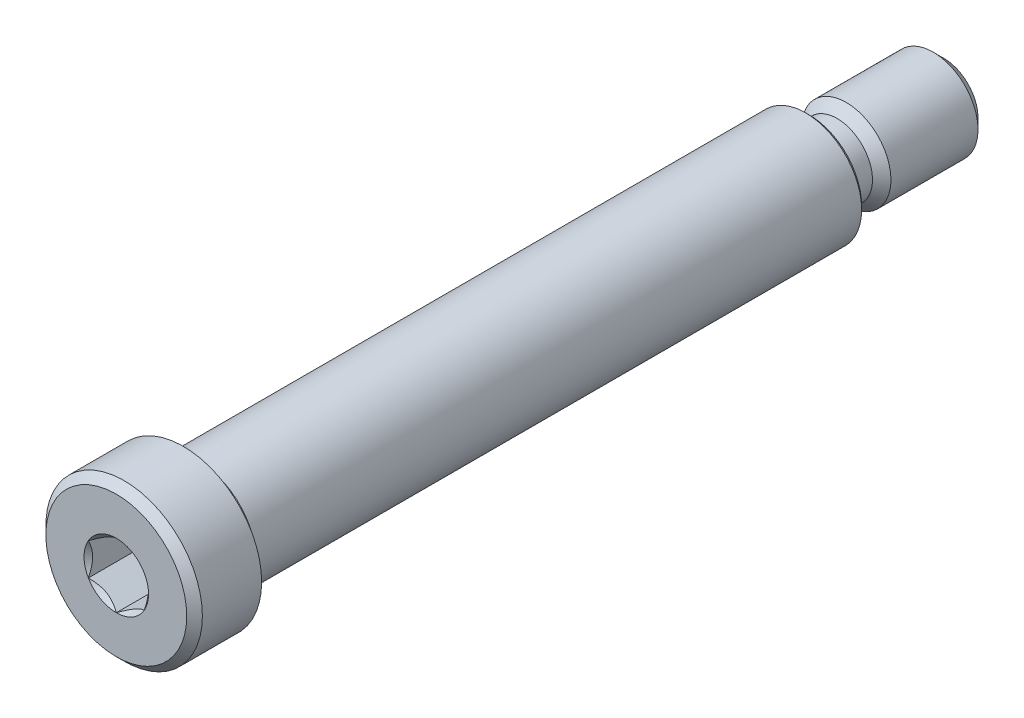
ISO-10303-21;
HEADER;
FILE_DESCRIPTION(('STEP AP214'),'2;1');
FILE_NAME('part.step','',(''),(''),'','','');
FILE_SCHEMA(('AUTOMOTIVE_DESIGN { 1 0 10303 214 1 1 1 1 }'));
ENDSEC;
DATA;
#1=APPLICATION_CONTEXT('core data for automotive mechanical design processes');
#2=APPLICATION_PROTOCOL_DEFINITION('international standard','automotive_design',2000,#1);
#3=PRODUCT_CONTEXT('',#1,'mechanical');
#4=PRODUCT('Part','Part','',(#3));
#5=PRODUCT_RELATED_PRODUCT_CATEGORY('part','',(#4));
#6=PRODUCT_DEFINITION_FORMATION('','',#4);
#7=PRODUCT_DEFINITION_CONTEXT('part definition',#1,'design');
#8=PRODUCT_DEFINITION('design','',#6,#7);
#9=PRODUCT_DEFINITION_SHAPE('','',#8);
#10=(LENGTH_UNIT() NAMED_UNIT(*) SI_UNIT(.MILLI.,.METRE.));
#11=(NAMED_UNIT(*) PLANE_ANGLE_UNIT() SI_UNIT($,.RADIAN.));
#12=(NAMED_UNIT(*) SI_UNIT($,.STERADIAN.) SOLID_ANGLE_UNIT());
#13=UNCERTAINTY_MEASURE_WITH_UNIT(LENGTH_MEASURE(1.E-05),#10,'distance_accuracy_value','');
#14=(GEOMETRIC_REPRESENTATION_CONTEXT(3) GLOBAL_UNCERTAINTY_ASSIGNED_CONTEXT((#13)) GLOBAL_UNIT_ASSIGNED_CONTEXT((#10,
#11,#12)) REPRESENTATION_CONTEXT('',''));
#15=CARTESIAN_POINT('',(0.,0.,0.));
#16=DIRECTION('',(0.,0.,1.));
#17=DIRECTION('',(1.,0.,0.));
#18=AXIS2_PLACEMENT_3D('',#15,#16,#17);
#19=CARTESIAN_POINT('',(0.,10.00125,58.7375));
#20=DIRECTION('',(0.,0.,-1.));
#21=DIRECTION('',(-1.,0.,0.));
#22=AXIS2_PLACEMENT_3D('',#19,#20,#21);
#23=PLANE('',#22);
#24=CARTESIAN_POINT('',(0.,0.,58.7375));
#25=DIRECTION('',(0.,0.,1.));
#26=DIRECTION('',(1.,0.,0.));
#27=AXIS2_PLACEMENT_3D('',#24,#25,#26);
#28=CIRCLE('',#27,4.58271776169266);
#29=CARTESIAN_POINT('',(-3.96875,2.29135888084633,58.7375));
#30=VERTEX_POINT('',#29);
#31=CARTESIAN_POINT('',(-3.96875,-2.29135888084633,58.7375));
#32=VERTEX_POINT('',#31);
#33=EDGE_CURVE('E137',#30,#32,#28,.T.);
#34=ORIENTED_EDGE('',*,*,#33,.F.);
#35=CARTESIAN_POINT('',(0.,4.58271776169266,58.7375));
#36=VERTEX_POINT('',#35);
#37=EDGE_CURVE('E132',#36,#30,#28,.T.);
#38=ORIENTED_EDGE('',*,*,#37,.F.);
#39=CARTESIAN_POINT('',(3.96875,2.29135888084633,58.7375));
#40=VERTEX_POINT('',#39);
#41=EDGE_CURVE('E104',#40,#36,#28,.T.);
#42=ORIENTED_EDGE('',*,*,#41,.F.);
#43=CARTESIAN_POINT('',(3.96875,-2.29135888084633,58.7375));
#44=VERTEX_POINT('',#43);
#45=EDGE_CURVE('E94',#44,#40,#28,.T.);
#46=ORIENTED_EDGE('',*,*,#45,.F.);
#47=CARTESIAN_POINT('',(0.,-4.58271776169266,58.7375));
#48=VERTEX_POINT('',#47);
#49=EDGE_CURVE('E55',#48,#44,#28,.T.);
#50=ORIENTED_EDGE('',*,*,#49,.F.);
#51=EDGE_CURVE('E62',#32,#48,#28,.T.);
#52=ORIENTED_EDGE('',*,*,#51,.F.);
#53=EDGE_LOOP('',(#34,#38,#42,#46,#50,#52));
#54=FACE_BOUND('',#53,.T.);
#55=CARTESIAN_POINT('',(0.,0.,58.7375));
#56=DIRECTION('',(0.,0.,1.));
#57=DIRECTION('',(1.,0.,0.));
#58=AXIS2_PLACEMENT_3D('',#55,#56,#57);
#59=CIRCLE('',#58,10.00125);
#60=CARTESIAN_POINT('',(10.00125,0.,58.7375));
#61=VERTEX_POINT('',#60);
#62=EDGE_CURVE('E49',#61,#61,#59,.T.);
#63=ORIENTED_EDGE('',*,*,#62,.T.);
#64=EDGE_LOOP('',(#63));
#65=FACE_BOUND('',#64,.T.);
#66=ADVANCED_FACE('F41',(#54,#65),#23,.F.);
#67=CARTESIAN_POINT('',(0.,0.,57.62625));
#68=DIRECTION('',(0.,0.,-1.));
#69=DIRECTION('',(-1.,0.,0.));
#70=AXIS2_PLACEMENT_3D('',#67,#68,#69);
#71=CONICAL_SURFACE('',#70,11.1125,0.785398163397448);
#72=ORIENTED_EDGE('',*,*,#62,.F.);
#73=EDGE_LOOP('',(#72));
#74=FACE_BOUND('',#73,.T.);
#75=CARTESIAN_POINT('',(0.,0.,57.62625));
#76=DIRECTION('',(0.,0.,1.));
#77=DIRECTION('',(1.,0.,0.));
#78=AXIS2_PLACEMENT_3D('',#75,#76,#77);
#79=CIRCLE('',#78,11.1125);
#80=CARTESIAN_POINT('',(11.1125,0.,57.62625));
#81=VERTEX_POINT('',#80);
#82=EDGE_CURVE('E307',#81,#81,#79,.T.);
#83=ORIENTED_EDGE('',*,*,#82,.T.);
#84=EDGE_LOOP('',(#83));
#85=FACE_BOUND('',#84,.T.);
#86=ADVANCED_FACE('F209',(#74,#85),#71,.T.);
#87=CARTESIAN_POINT('',(0.,0.,58.7375));
#88=DIRECTION('',(0.,0.,1.));
#89=DIRECTION('',(1.,0.,0.));
#90=AXIS2_PLACEMENT_3D('',#87,#88,#89);
#91=CYLINDRICAL_SURFACE('',#90,11.1125);
#92=ORIENTED_EDGE('',*,*,#82,.F.);
#93=EDGE_LOOP('',(#92));
#94=FACE_BOUND('',#93,.T.);
#95=CARTESIAN_POINT('',(0.,0.,49.2125));
#96=DIRECTION('',(0.,0.,1.));
#97=DIRECTION('',(1.,0.,0.));
#98=AXIS2_PLACEMENT_3D('',#95,#96,#97);
#99=CIRCLE('',#98,11.1125);
#100=CARTESIAN_POINT('',(11.1125,0.,49.2125));
#101=VERTEX_POINT('',#100);
#102=EDGE_CURVE('E304',#101,#101,#99,.T.);
#103=ORIENTED_EDGE('',*,*,#102,.T.);
#104=EDGE_LOOP('',(#103));
#105=FACE_BOUND('',#104,.T.);
#106=ADVANCED_FACE('F215',(#94,#105),#91,.T.);
#107=CARTESIAN_POINT('',(0.,11.1125,49.2125));
#108=DIRECTION('',(0.,0.,1.));
#109=DIRECTION('',(1.,0.,0.));
#110=AXIS2_PLACEMENT_3D('',#107,#108,#109);
#111=PLANE('',#110);
#112=ORIENTED_EDGE('',*,*,#102,.F.);
#113=EDGE_LOOP('',(#112));
#114=FACE_BOUND('',#113,.T.);
#115=CARTESIAN_POINT('',(0.,0.,49.2125));
#116=DIRECTION('',(0.,0.,1.));
#117=DIRECTION('',(1.,0.,0.));
#118=AXIS2_PLACEMENT_3D('',#115,#116,#117);
#119=CIRCLE('',#118,7.9375);
#120=CARTESIAN_POINT('',(7.9375,0.,49.2125));
#121=VERTEX_POINT('',#120);
#122=EDGE_CURVE('E301',#121,#121,#119,.T.);
#123=ORIENTED_EDGE('',*,*,#122,.T.);
#124=EDGE_LOOP('',(#123));
#125=FACE_BOUND('',#124,.T.);
#126=ADVANCED_FACE('F220',(#114,#125),#111,.F.);
#127=CARTESIAN_POINT('',(0.,0.,48.815625));
#128=DIRECTION('',(0.,0.,1.));
#129=DIRECTION('',(1.,0.,0.));
#130=AXIS2_PLACEMENT_3D('',#127,#128,#129);
#131=CONICAL_SURFACE('',#130,7.540625,0.785398163397443);
#132=ORIENTED_EDGE('',*,*,#122,.F.);
#133=EDGE_LOOP('',(#132));
#134=FACE_BOUND('',#133,.T.);
#135=CARTESIAN_POINT('',(0.,0.,48.815625));
#136=DIRECTION('',(0.,0.,1.));
#137=DIRECTION('',(1.,0.,0.));
#138=AXIS2_PLACEMENT_3D('',#135,#136,#137);
#139=CIRCLE('',#138,7.540625);
#140=CARTESIAN_POINT('',(7.540625,0.,48.815625));
#141=VERTEX_POINT('',#140);
#142=EDGE_CURVE('E298',#141,#141,#139,.T.);
#143=ORIENTED_EDGE('',*,*,#142,.T.);
#144=EDGE_LOOP('',(#143));
#145=FACE_BOUND('',#144,.T.);
#146=ADVANCED_FACE('F228',(#134,#145),#131,.T.);
#147=CARTESIAN_POINT('',(0.,0.,58.7375));
#148=DIRECTION('',(0.,0.,1.));
#149=DIRECTION('',(1.,0.,0.));
#150=AXIS2_PLACEMENT_3D('',#147,#148,#149);
#151=CYLINDRICAL_SURFACE('',#150,7.540625);
#152=ORIENTED_EDGE('',*,*,#142,.F.);
#153=EDGE_LOOP('',(#152));
#154=FACE_BOUND('',#153,.T.);
#155=CARTESIAN_POINT('',(0.,0.,47.247175));
#156=DIRECTION('',(0.,0.,1.));
#157=DIRECTION('',(1.,0.,0.));
#158=AXIS2_PLACEMENT_3D('',#155,#156,#157);
#159=CIRCLE('',#158,7.540625);
#160=CARTESIAN_POINT('',(7.540625,0.,47.247175));
#161=VERTEX_POINT('',#160);
#162=EDGE_CURVE('E295',#161,#161,#159,.T.);
#163=ORIENTED_EDGE('',*,*,#162,.T.);
#164=EDGE_LOOP('',(#163));
#165=FACE_BOUND('',#164,.T.);
#166=ADVANCED_FACE('F232',(#154,#165),#151,.T.);
#167=CARTESIAN_POINT('',(0.,0.,46.8503));
#168=DIRECTION('',(0.,0.,-1.));
#169=DIRECTION('',(-1.,0.,0.));
#170=AXIS2_PLACEMENT_3D('',#167,#168,#169);
#171=CONICAL_SURFACE('',#170,7.9375,0.785398163397442);
#172=ORIENTED_EDGE('',*,*,#162,.F.);
#173=EDGE_LOOP('',(#172));
#174=FACE_BOUND('',#173,.T.);
#175=CARTESIAN_POINT('',(0.,0.,46.8503));
#176=DIRECTION('',(0.,0.,1.));
#177=DIRECTION('',(1.,0.,0.));
#178=AXIS2_PLACEMENT_3D('',#175,#176,#177);
#179=CIRCLE('',#178,7.9375);
#180=CARTESIAN_POINT('',(7.9375,0.,46.8503));
#181=VERTEX_POINT('',#180);
#182=EDGE_CURVE('E292',#181,#181,#179,.T.);
#183=ORIENTED_EDGE('',*,*,#182,.T.);
#184=EDGE_LOOP('',(#183));
#185=FACE_BOUND('',#184,.T.);
#186=ADVANCED_FACE('F236',(#174,#185),#171,.T.);
#187=CARTESIAN_POINT('',(0.,0.,58.7375));
#188=DIRECTION('',(0.,0.,1.));
#189=DIRECTION('',(1.,0.,0.));
#190=AXIS2_PLACEMENT_3D('',#187,#188,#189);
#191=CYLINDRICAL_SURFACE('',#190,7.9375);
#192=ORIENTED_EDGE('',*,*,#182,.F.);
#193=EDGE_LOOP('',(#192));
#194=FACE_BOUND('',#193,.T.);
#195=CARTESIAN_POINT('',(0.,0.,-39.1583333333333));
#196=DIRECTION('',(0.,0.,1.));
#197=DIRECTION('',(1.,0.,0.));
#198=AXIS2_PLACEMENT_3D('',#195,#196,#197);
#199=CIRCLE('',#198,7.9375);
#200=CARTESIAN_POINT('',(7.9375,0.,-39.1583333333333));
#201=VERTEX_POINT('',#200);
#202=EDGE_CURVE('E289',#201,#201,#199,.T.);
#203=ORIENTED_EDGE('',*,*,#202,.T.);
#204=EDGE_LOOP('',(#203));
#205=FACE_BOUND('',#204,.T.);
#206=ADVANCED_FACE('F240',(#194,#205),#191,.T.);
#207=CARTESIAN_POINT('',(0.,0.,-39.6875));
#208=DIRECTION('',(0.,0.,1.));
#209=DIRECTION('',(1.,0.,0.));
#210=AXIS2_PLACEMENT_3D('',#207,#208,#209);
#211=CONICAL_SURFACE('',#210,7.40833333333333,0.785398163397451);
#212=ORIENTED_EDGE('',*,*,#202,.F.);
#213=EDGE_LOOP('',(#212));
#214=FACE_BOUND('',#213,.T.);
#215=CARTESIAN_POINT('',(0.,0.,-39.6875));
#216=DIRECTION('',(0.,0.,1.));
#217=DIRECTION('',(1.,0.,0.));
#218=AXIS2_PLACEMENT_3D('',#215,#216,#217);
#219=CIRCLE('',#218,7.40833333333333);
#220=CARTESIAN_POINT('',(7.40833333333333,0.,-39.6875));
#221=VERTEX_POINT('',#220);
#222=EDGE_CURVE('E277',#221,#221,#219,.T.);
#223=ORIENTED_EDGE('',*,*,#222,.T.);
#224=EDGE_LOOP('',(#223));
#225=FACE_BOUND('',#224,.T.);
#226=ADVANCED_FACE('F244',(#214,#225),#211,.T.);
#227=CARTESIAN_POINT('',(0.,7.40833333333333,-39.6875));
#228=DIRECTION('',(0.,0.,1.));
#229=DIRECTION('',(1.,0.,0.));
#230=AXIS2_PLACEMENT_3D('',#227,#228,#229);
#231=PLANE('',#230);
#232=CARTESIAN_POINT('',(0.,0.,-39.6875));
#233=DIRECTION('',(0.,0.,-1.));
#234=DIRECTION('',(-1.,0.,0.));
#235=AXIS2_PLACEMENT_3D('',#232,#233,#234);
#236=CIRCLE('',#235,6.35);
#237=CARTESIAN_POINT('',(-6.35,0.,-39.6875));
#238=VERTEX_POINT('',#237);
#239=EDGE_CURVE('E418',#238,#238,#236,.T.);
#240=ORIENTED_EDGE('',*,*,#239,.F.);
#241=EDGE_LOOP('',(#240));
#242=FACE_BOUND('',#241,.T.);
#243=ORIENTED_EDGE('',*,*,#222,.F.);
#244=EDGE_LOOP('',(#243));
#245=FACE_BOUND('',#244,.T.);
#246=ADVANCED_FACE('F248',(#242,#245),#231,.F.);
#247=CARTESIAN_POINT('',(0.,0.,58.7375));
#248=DIRECTION('',(0.,0.,1.));
#249=DIRECTION('',(1.,0.,0.));
#250=AXIS2_PLACEMENT_3D('',#247,#248,#249);
#251=CONICAL_SURFACE('',#250,4.58271776169266,0.78539816339745);
#252=ORIENTED_EDGE('',*,*,#41,.T.);
#253=CARTESIAN_POINT('',(3.96895,2.29124341079249,58.7376154744179));
#254=CARTESIAN_POINT('',(3.90070631961403,2.33064391803382,58.6982190135033));
#255=CARTESIAN_POINT('',(3.83194041517815,2.37034593147094,58.6600312157826));
#256=CARTESIAN_POINT('',(3.69325658429113,2.45041507856582,58.5864413714603));
#257=CARTESIAN_POINT('',(3.62333805347101,2.49078256115616,58.5510408464105));
#258=CARTESIAN_POINT('',(3.41104249414032,2.61335145948349,58.4492709068352));
#259=CARTESIAN_POINT('',(3.26686116553347,2.69659458836677,58.3877673400195));
#260=CARTESIAN_POINT('',(2.97616433963261,2.86442847905321,58.2824392939681));
#261=CARTESIAN_POINT('',(2.82972227049757,2.94897684708901,58.2383495742591));
#262=CARTESIAN_POINT('',(2.53360446233565,3.11994054334313,58.1704143133903));
#263=CARTESIAN_POINT('',(2.38393779225421,3.20635063560337,58.1465180866405));
#264=CARTESIAN_POINT('',(2.12599327034477,3.35527497476377,58.1249580589113));
#265=CARTESIAN_POINT('',(2.01804775340514,3.41759734802668,58.1217672072687));
#266=CARTESIAN_POINT('',(1.80233192125731,3.54214094178569,58.1271459790003));
#267=CARTESIAN_POINT('',(1.69456168072373,3.60436211916838,58.1357197250599));
#268=CARTESIAN_POINT('',(1.4800423442556,3.72821491582464,58.1641386528729));
#269=CARTESIAN_POINT('',(1.37329452642675,3.78984579718353,58.1839964410767));
#270=CARTESIAN_POINT('',(1.16163222562764,3.91204908352719,58.2338994540715));
#271=CARTESIAN_POINT('',(1.05671760273993,3.97262156929334,58.2639438977693));
#272=CARTESIAN_POINT('',(0.870468750364797,4.08015239434838,58.3257572973969));
#273=CARTESIAN_POINT('',(0.788722168980523,4.12734880511592,58.3559010313299));
#274=CARTESIAN_POINT('',(0.626696508140921,4.2208943640173,58.4210463964783));
#275=CARTESIAN_POINT('',(0.546417473415701,4.26724348632619,58.456048175486));
#276=CARTESIAN_POINT('',(0.387579832088065,4.35894844130414,58.5301249778602));
#277=CARTESIAN_POINT('',(0.309016707855576,4.40430688222815,58.5691871925354));
#278=CARTESIAN_POINT('',(0.153345359631081,4.49418377703067,58.6508719201149));
#279=CARTESIAN_POINT('',(0.0762362781339246,4.53870272599002,58.693492248695));
#280=CARTESIAN_POINT('',(-0.0001999999999987,4.58283323174649,58.7376154744179));
#281=B_SPLINE_CURVE_WITH_KNOTS('',3,(#253,#254,#255,#256,#257,#258,#259,#260,#261,#262,#263,
#264,#265,#266,#267,#268,#269,#270,#271,#272,#273,#274,#275,#276,#277,#278,#279,#280),
.UNSPECIFIED.,.F.,.F.,(4,2,2,2,2,2,2,2,2,2,2,2,2,4),(0.,0.264281222504268,0.528705728104604,
1.06040984450885,1.58367029033775,2.10561342008457,2.47914251806346,2.8528025458361,
3.22688084694382,3.60093047093424,3.89805841615096,4.19519540263381,4.49142198422536,
4.78746803121399),.UNSPECIFIED.);
#282=EDGE_CURVE('E11',#40,#36,#281,.T.);
#283=ORIENTED_EDGE('',*,*,#282,.F.);
#284=EDGE_LOOP('',(#252,#283));
#285=FACE_BOUND('',#284,.T.);
#286=ADVANCED_FACE('F107',(#285),#251,.F.);
#287=ORIENTED_EDGE('',*,*,#37,.T.);
#288=CARTESIAN_POINT('',(0.000200000000001232,4.58283323174649,58.7376154744179));
#289=CARTESIAN_POINT('',(-0.0680436803859715,4.54343272450516,58.6982190135033));
#290=CARTESIAN_POINT('',(-0.136809584821845,4.50373071106804,58.6600312157826));
#291=CARTESIAN_POINT('',(-0.275493415708873,4.42366156397317,58.5864413714603));
#292=CARTESIAN_POINT('',(-0.34541194652899,4.38329408138283,58.5510408464105));
#293=CARTESIAN_POINT('',(-0.557707505859675,4.2607251830555,58.4492709068352));
#294=CARTESIAN_POINT('',(-0.701888834466529,4.17748205417221,58.3877673400195));
#295=CARTESIAN_POINT('',(-0.992585660367393,4.00964816348578,58.2824392939681));
#296=CARTESIAN_POINT('',(-1.13902772950243,3.92509979544998,58.2383495742591));
#297=CARTESIAN_POINT('',(-1.43514553766435,3.75413609919585,58.1704143133903));
#298=CARTESIAN_POINT('',(-1.58481220774579,3.66772600693562,58.1465180866405));
#299=CARTESIAN_POINT('',(-1.84275672965523,3.51880166777522,58.1249580589113));
#300=CARTESIAN_POINT('',(-1.95070224659486,3.45647929451231,58.1217672072687));
#301=CARTESIAN_POINT('',(-2.16641807874268,3.3319357007533,58.1271459790003));
#302=CARTESIAN_POINT('',(-2.27418831927627,3.2697145233706,58.1357197250599));
#303=CARTESIAN_POINT('',(-2.4887076557444,3.14586172671434,58.1641386528729));
#304=CARTESIAN_POINT('',(-2.59545547357325,3.08423084535545,58.1839964410767));
#305=CARTESIAN_POINT('',(-2.80711777437236,2.96202755901179,58.2338994540715));
#306=CARTESIAN_POINT('',(-2.91203239726007,2.90145507324564,58.2639438977693));
#307=CARTESIAN_POINT('',(-3.0982812496352,2.7939242481906,58.3257572973969));
#308=CARTESIAN_POINT('',(-3.18002783101948,2.74672783742306,58.3559010313299));
#309=CARTESIAN_POINT('',(-3.34205349185908,2.65318227852169,58.4210463964783));
#310=CARTESIAN_POINT('',(-3.4223325265843,2.6068331562128,58.4560481754861));
#311=CARTESIAN_POINT('',(-3.58117016791194,2.51512820123484,58.5301249778602));
#312=CARTESIAN_POINT('',(-3.65973329214443,2.46976976031084,58.5691871925354));
#313=CARTESIAN_POINT('',(-3.81540464036892,2.37989286550831,58.6508719201149));
#314=CARTESIAN_POINT('',(-3.89251372186608,2.33537391654897,58.693492248695));
#315=CARTESIAN_POINT('',(-3.96895,2.29124341079249,58.7376154744179));
#316=B_SPLINE_CURVE_WITH_KNOTS('',3,(#288,#289,#290,#291,#292,#293,#294,#295,#296,#297,#298,
#299,#300,#301,#302,#303,#304,#305,#306,#307,#308,#309,#310,#311,#312,#313,#314,#315),
.UNSPECIFIED.,.F.,.F.,(4,2,2,2,2,2,2,2,2,2,2,2,2,4),(0.,0.264281222504268,0.528705728104604,
1.06040984450885,1.58367029033775,2.10561342008457,2.47914251806346,2.8528025458361,
3.22688084694382,3.60093047093424,3.89805841615097,4.19519540263381,4.49142198422536,
4.787468031214),.UNSPECIFIED.);
#317=EDGE_CURVE('E133',#36,#30,#316,.T.);
#318=ORIENTED_EDGE('',*,*,#317,.F.);
#319=EDGE_LOOP('',(#287,#318));
#320=FACE_BOUND('',#319,.T.);
#321=ADVANCED_FACE('F340',(#320),#251,.F.);
#322=ORIENTED_EDGE('',*,*,#33,.T.);
#323=CARTESIAN_POINT('',(-3.96875,-4.56990484315644,60.2074681576331));
#324=CARTESIAN_POINT('',(-3.96875,-4.45863268424877,60.1234744466099));
#325=CARTESIAN_POINT('',(-3.96875,-4.34673751853659,60.0402926459744));
#326=CARTESIAN_POINT('',(-3.96875,-4.12145541759773,59.8759163849862));
#327=CARTESIAN_POINT('',(-3.96875,-4.00806811494044,59.7947224287616));
#328=CARTESIAN_POINT('',(-3.96875,-3.77872655840531,59.6341080907353));
#329=CARTESIAN_POINT('',(-3.96875,-3.66275922236845,59.5547063256493));
#330=CARTESIAN_POINT('',(-3.96875,-3.42885613076908,59.3988665390494));
#331=CARTESIAN_POINT('',(-3.96875,-3.31092051512029,59.3224283081475));
#332=CARTESIAN_POINT('',(-3.96875,-3.06596138286376,59.1689091143357));
#333=CARTESIAN_POINT('',(-3.96875,-2.9388037115444,59.0920411250438));
#334=CARTESIAN_POINT('',(-3.96875,-2.68152025411325,58.9433625301378));
#335=CARTESIAN_POINT('',(-3.96875,-2.5513940020545,58.8715527257854));
#336=CARTESIAN_POINT('',(-3.96875,-2.28818548732399,58.7345399077643));
#337=CARTESIAN_POINT('',(-3.96875,-2.15511341733937,58.6693174667664));
#338=CARTESIAN_POINT('',(-3.96875,-1.88534004741321,58.5469394622813));
#339=CARTESIAN_POINT('',(-3.96875,-1.74864042427224,58.4897802462412));
#340=CARTESIAN_POINT('',(-3.96875,-1.48255876318203,58.3897577192134));
#341=CARTESIAN_POINT('',(-3.96875,-1.353473111467,58.346114131207));
#342=CARTESIAN_POINT('',(-3.96875,-1.09219394236273,58.2691829186578));
#343=CARTESIAN_POINT('',(-3.96875,-0.9600002115445,58.2358960075458));
#344=CARTESIAN_POINT('',(-3.96875,-0.695492941340556,58.1819702438101));
#345=CARTESIAN_POINT('',(-3.96875,-0.563224314368351,58.1611146869744));
#346=CARTESIAN_POINT('',(-3.96875,-0.297273068724065,58.1324564272277));
#347=CARTESIAN_POINT('',(-3.96875,-0.163590697091783,58.1246514805561));
#348=CARTESIAN_POINT('',(-3.96875,0.099031268845707,58.122674091002));
#349=CARTESIAN_POINT('',(-3.96875,0.227967389962744,58.1280184349991));
#350=CARTESIAN_POINT('',(-3.96875,0.484735191951156,58.1509783437385));
#351=CARTESIAN_POINT('',(-3.96875,0.612566764309969,58.1685951005717));
#352=CARTESIAN_POINT('',(-3.96875,0.868361511021704,58.2154383689789));
#353=CARTESIAN_POINT('',(-3.96875,0.996287921705624,58.244862449144));
#354=CARTESIAN_POINT('',(-3.96875,1.24935336573865,58.3137511262479));
#355=CARTESIAN_POINT('',(-3.96875,1.37449263136589,58.3532148830583));
#356=CARTESIAN_POINT('',(-3.96875,1.63331643386752,58.4446181464302));
#357=CARTESIAN_POINT('',(-3.96875,1.76670819120342,58.4973783645524));
#358=CARTESIAN_POINT('',(-3.96875,2.03002683124386,58.6109987064253));
#359=CARTESIAN_POINT('',(-3.96875,2.15995206580511,58.6718626034686));
#360=CARTESIAN_POINT('',(-3.96875,2.4169726125533,58.8002422212948));
#361=CARTESIAN_POINT('',(-3.96875,2.54405740766774,58.8677788281663));
#362=CARTESIAN_POINT('',(-3.96875,2.7953024456765,59.0080111262514));
#363=CARTESIAN_POINT('',(-3.96875,2.91946314953283,59.0807059969521));
#364=CARTESIAN_POINT('',(-3.96875,3.15913302861404,59.2265188944929));
#365=CARTESIAN_POINT('',(-3.96875,3.27476522917588,59.2994357740221));
#366=CARTESIAN_POINT('',(-3.96875,3.50404450455156,59.4483358118068));
#367=CARTESIAN_POINT('',(-3.96875,3.61769142806587,59.5243192023156));
#368=CARTESIAN_POINT('',(-3.96875,3.84233840610167,59.6781765206122));
#369=CARTESIAN_POINT('',(-3.96875,3.95335246245717,59.756030077566));
#370=CARTESIAN_POINT('',(-3.96875,4.17386344212358,59.9137960406035));
#371=CARTESIAN_POINT('',(-3.96875,4.28336077424872,59.9937078746187));
#372=CARTESIAN_POINT('',(-3.96875,4.39222298093244,60.0744612225708));
#373=B_SPLINE_CURVE_WITH_KNOTS('',3,(#323,#324,#325,#326,#327,#328,#329,#330,#331,#332,#333,
#334,#335,#336,#337,#338,#339,#340,#341,#342,#343,#344,#345,#346,#347,#348,#349,#350,#351,#352,
#353,#354,#355,#356,#357,#358,#359,#360,#361,#362,#363,#364,#365,#366,#367,#368,#369,#370,#371,
#372),.UNSPECIFIED.,.F.,.F.,(4,2,2,2,2,2,2,2,2,2,2,2,2,2,2,2,2,2,2,2,2,2,2,2,4),(0.,
0.418252140016641,0.836609274713134,1.25820795995598,1.67977680274237,2.12544086340517,
2.57117536322181,3.01555437338786,3.45973143381405,3.86816421344645,4.27662512218098,
4.67774000873369,5.0787859254598,5.4653156864629,5.85188299858475,6.24520796039676,
6.63850001927392,7.06850560534097,7.49871211849048,7.9303106517192,8.36184068483129,
8.77189246592985,9.18197536225169,9.5887271056262,9.99536699280667),.UNSPECIFIED.);
#374=EDGE_CURVE('E135',#30,#32,#373,.F.);
#375=ORIENTED_EDGE('',*,*,#374,.F.);
#376=EDGE_LOOP('',(#322,#375));
#377=FACE_BOUND('',#376,.T.);
#378=ADVANCED_FACE('F333',(#377),#251,.F.);
#379=ORIENTED_EDGE('',*,*,#51,.T.);
#380=CARTESIAN_POINT('',(-3.96895,-2.29124341079249,58.7376154744179));
#381=CARTESIAN_POINT('',(-3.90070631961403,-2.33064391803382,58.6982190135033));
#382=CARTESIAN_POINT('',(-3.83194041517815,-2.37034593147094,58.6600312157826));
#383=CARTESIAN_POINT('',(-3.69325658429113,-2.45041507856581,58.5864413714603));
#384=CARTESIAN_POINT('',(-3.62333805347101,-2.49078256115615,58.5510408464105));
#385=CARTESIAN_POINT('',(-3.41104249414032,-2.61335145948349,58.4492709068352));
#386=CARTESIAN_POINT('',(-3.26686116553347,-2.69659458836677,58.3877673400195));
#387=CARTESIAN_POINT('',(-2.97616433963261,-2.8644284790532,58.2824392939681));
#388=CARTESIAN_POINT('',(-2.82972227049757,-2.948976847089,58.2383495742591));
#389=CARTESIAN_POINT('',(-2.53360446233565,-3.11994054334313,58.1704143133903));
#390=CARTESIAN_POINT('',(-2.38393779225421,-3.20635063560337,58.1465180866405));
#391=CARTESIAN_POINT('',(-2.12599327034477,-3.35527497476377,58.1249580589113));
#392=CARTESIAN_POINT('',(-2.01804775340514,-3.41759734802668,58.1217672072687));
#393=CARTESIAN_POINT('',(-1.80233192125731,-3.54214094178569,58.1271459790003));
#394=CARTESIAN_POINT('',(-1.69456168072373,-3.60436211916838,58.1357197250599));
#395=CARTESIAN_POINT('',(-1.4800423442556,-3.72821491582464,58.1641386528729));
#396=CARTESIAN_POINT('',(-1.37329452642675,-3.78984579718353,58.1839964410767));
#397=CARTESIAN_POINT('',(-1.16163222562764,-3.91204908352719,58.2338994540715));
#398=CARTESIAN_POINT('',(-1.05671760273993,-3.97262156929334,58.2639438977693));
#399=CARTESIAN_POINT('',(-0.870468750364796,-4.08015239434838,58.3257572973969));
#400=CARTESIAN_POINT('',(-0.788722168980521,-4.12734880511593,58.3559010313299));
#401=CARTESIAN_POINT('',(-0.626696508140919,-4.2208943640173,58.4210463964783));
#402=CARTESIAN_POINT('',(-0.5464174734157,-4.26724348632619,58.456048175486));
#403=CARTESIAN_POINT('',(-0.387579832088064,-4.35894844130414,58.5301249778602));
#404=CARTESIAN_POINT('',(-0.309016707855575,-4.40430688222815,58.5691871925354));
#405=CARTESIAN_POINT('',(-0.15334535963108,-4.49418377703067,58.6508719201149));
#406=CARTESIAN_POINT('',(-0.0762362781339236,-4.53870272599002,58.693492248695));
#407=CARTESIAN_POINT('',(0.000199999999999732,-4.58283323174649,58.7376154744179));
#408=B_SPLINE_CURVE_WITH_KNOTS('',3,(#380,#381,#382,#383,#384,#385,#386,#387,#388,#389,#390,
#391,#392,#393,#394,#395,#396,#397,#398,#399,#400,#401,#402,#403,#404,#405,#406,#407),
.UNSPECIFIED.,.F.,.F.,(4,2,2,2,2,2,2,2,2,2,2,2,2,4),(0.,0.264281222504268,0.528705728104604,
1.06040984450885,1.58367029033775,2.10561342008457,2.47914251806346,2.8528025458361,
3.22688084694382,3.60093047093424,3.89805841615097,4.19519540263381,4.49142198422536,
4.787468031214),.UNSPECIFIED.);
#409=EDGE_CURVE('E175',#32,#48,#408,.T.);
#410=ORIENTED_EDGE('',*,*,#409,.F.);
#411=EDGE_LOOP('',(#379,#410));
#412=FACE_BOUND('',#411,.T.);
#413=ADVANCED_FACE('F334',(#412),#251,.F.);
#414=ORIENTED_EDGE('',*,*,#49,.T.);
#415=CARTESIAN_POINT('',(-0.000200000000000511,-4.58283323174649,58.7376154744179));
#416=CARTESIAN_POINT('',(0.0680436803859723,-4.54343272450516,58.6982190135033));
#417=CARTESIAN_POINT('',(0.136809584821846,-4.50373071106804,58.6600312157826));
#418=CARTESIAN_POINT('',(0.275493415708874,-4.42366156397317,58.5864413714603));
#419=CARTESIAN_POINT('',(0.345411946528991,-4.38329408138283,58.5510408464105));
#420=CARTESIAN_POINT('',(0.557707505859676,-4.2607251830555,58.4492709068352));
#421=CARTESIAN_POINT('',(0.70188883446653,-4.17748205417221,58.3877673400195));
#422=CARTESIAN_POINT('',(0.992585660367394,-4.00964816348578,58.2824392939681));
#423=CARTESIAN_POINT('',(1.13902772950243,-3.92509979544998,58.2383495742591));
#424=CARTESIAN_POINT('',(1.43514553766435,-3.75413609919585,58.1704143133903));
#425=CARTESIAN_POINT('',(1.58481220774579,-3.66772600693562,58.1465180866405));
#426=CARTESIAN_POINT('',(1.84275672965523,-3.51880166777522,58.1249580589113));
#427=CARTESIAN_POINT('',(1.95070224659486,-3.45647929451231,58.1217672072687));
#428=CARTESIAN_POINT('',(2.16641807874268,-3.3319357007533,58.1271459790003));
#429=CARTESIAN_POINT('',(2.27418831927627,-3.2697145233706,58.1357197250599));
#430=CARTESIAN_POINT('',(2.4887076557444,-3.14586172671434,58.1641386528729));
#431=CARTESIAN_POINT('',(2.59545547357325,-3.08423084535545,58.1839964410767));
#432=CARTESIAN_POINT('',(2.80711777437236,-2.96202755901179,58.2338994540715));
#433=CARTESIAN_POINT('',(2.91203239726007,-2.90145507324564,58.2639438977693));
#434=CARTESIAN_POINT('',(3.0982812496352,-2.7939242481906,58.3257572973969));
#435=CARTESIAN_POINT('',(3.18002783101948,-2.74672783742306,58.3559010313299));
#436=CARTESIAN_POINT('',(3.34205349185908,-2.65318227852169,58.4210463964783));
#437=CARTESIAN_POINT('',(3.4223325265843,-2.6068331562128,58.456048175486));
#438=CARTESIAN_POINT('',(3.58117016791194,-2.51512820123484,58.5301249778602));
#439=CARTESIAN_POINT('',(3.65973329214443,-2.46976976031084,58.5691871925354));
#440=CARTESIAN_POINT('',(3.81540464036892,-2.37989286550831,58.6508719201149));
#441=CARTESIAN_POINT('',(3.89251372186608,-2.33537391654897,58.693492248695));
#442=CARTESIAN_POINT('',(3.96895,-2.29124341079249,58.7376154744179));
#443=B_SPLINE_CURVE_WITH_KNOTS('',3,(#415,#416,#417,#418,#419,#420,#421,#422,#423,#424,#425,
#426,#427,#428,#429,#430,#431,#432,#433,#434,#435,#436,#437,#438,#439,#440,#441,#442),
.UNSPECIFIED.,.F.,.F.,(4,2,2,2,2,2,2,2,2,2,2,2,2,4),(0.,0.264281222504268,0.528705728104605,
1.06040984450885,1.58367029033775,2.10561342008457,2.47914251806346,2.8528025458361,
3.22688084694382,3.60093047093424,3.89805841615096,4.19519540263381,4.49142198422536,
4.787468031214),.UNSPECIFIED.);
#444=EDGE_CURVE('E119',#48,#44,#443,.T.);
#445=ORIENTED_EDGE('',*,*,#444,.F.);
#446=EDGE_LOOP('',(#414,#445));
#447=FACE_BOUND('',#446,.T.);
#448=ADVANCED_FACE('F161',(#447),#251,.F.);
#449=ORIENTED_EDGE('',*,*,#45,.T.);
#450=CARTESIAN_POINT('',(3.96875,-4.56990484315645,60.2074681576331));
#451=CARTESIAN_POINT('',(3.96875,-4.45863268424877,60.1234744466099));
#452=CARTESIAN_POINT('',(3.96875,-4.34673751853659,60.0402926459744));
#453=CARTESIAN_POINT('',(3.96875,-4.12145541759773,59.8759163849862));
#454=CARTESIAN_POINT('',(3.96875,-4.00806811494044,59.7947224287616));
#455=CARTESIAN_POINT('',(3.96875,-3.77872655840531,59.6341080907353));
#456=CARTESIAN_POINT('',(3.96875,-3.66275922236845,59.5547063256493));
#457=CARTESIAN_POINT('',(3.96875,-3.42885613076908,59.3988665390494));
#458=CARTESIAN_POINT('',(3.96875,-3.31092051512029,59.3224283081475));
#459=CARTESIAN_POINT('',(3.96875,-3.06596138286377,59.1689091143357));
#460=CARTESIAN_POINT('',(3.96875,-2.9388037115444,59.0920411250438));
#461=CARTESIAN_POINT('',(3.96875,-2.68152025411326,58.9433625301378));
#462=CARTESIAN_POINT('',(3.96875,-2.55139400205451,58.8715527257854));
#463=CARTESIAN_POINT('',(3.96875,-2.288185487324,58.7345399077643));
#464=CARTESIAN_POINT('',(3.96875,-2.15511341733937,58.6693174667664));
#465=CARTESIAN_POINT('',(3.96875,-1.88534004741321,58.5469394622813));
#466=CARTESIAN_POINT('',(3.96875,-1.74864042427225,58.4897802462412));
#467=CARTESIAN_POINT('',(3.96875,-1.48255876318203,58.3897577192134));
#468=CARTESIAN_POINT('',(3.96875,-1.353473111467,58.346114131207));
#469=CARTESIAN_POINT('',(3.96875,-1.09219394236274,58.2691829186578));
#470=CARTESIAN_POINT('',(3.96875,-0.960000211544503,58.2358960075458));
#471=CARTESIAN_POINT('',(3.96875,-0.695492941340558,58.1819702438101));
#472=CARTESIAN_POINT('',(3.96875,-0.563224314368353,58.1611146869744));
#473=CARTESIAN_POINT('',(3.96875,-0.297273068724067,58.1324564272277));
#474=CARTESIAN_POINT('',(3.96875,-0.163590697091786,58.1246514805561));
#475=CARTESIAN_POINT('',(3.96875,0.0990312688457044,58.122674091002));
#476=CARTESIAN_POINT('',(3.96875,0.227967389962741,58.1280184349991));
#477=CARTESIAN_POINT('',(3.96875,0.484735191951153,58.1509783437385));
#478=CARTESIAN_POINT('',(3.96875,0.612566764309967,58.1685951005717));
#479=CARTESIAN_POINT('',(3.96875,0.868361511021703,58.2154383689789));
#480=CARTESIAN_POINT('',(3.96875,0.996287921705622,58.244862449144));
#481=CARTESIAN_POINT('',(3.96875,1.24935336573865,58.3137511262479));
#482=CARTESIAN_POINT('',(3.96875,1.37449263136589,58.3532148830583));
#483=CARTESIAN_POINT('',(3.96875,1.63331643386752,58.4446181464302));
#484=CARTESIAN_POINT('',(3.96875,1.76670819120342,58.4973783645524));
#485=CARTESIAN_POINT('',(3.96875,2.03002683124387,58.6109987064253));
#486=CARTESIAN_POINT('',(3.96875,2.15995206580511,58.6718626034686));
#487=CARTESIAN_POINT('',(3.96875,2.41697261255329,58.8002422212948));
#488=CARTESIAN_POINT('',(3.96875,2.54405740766773,58.8677788281663));
#489=CARTESIAN_POINT('',(3.96875,2.7953024456765,59.0080111262514));
#490=CARTESIAN_POINT('',(3.96875,2.91946314953282,59.0807059969521));
#491=CARTESIAN_POINT('',(3.96875,3.15913302861404,59.2265188944929));
#492=CARTESIAN_POINT('',(3.96875,3.27476522917588,59.2994357740221));
#493=CARTESIAN_POINT('',(3.96875,3.50404450455156,59.4483358118068));
#494=CARTESIAN_POINT('',(3.96875,3.61769142806587,59.5243192023156));
#495=CARTESIAN_POINT('',(3.96875,3.84233840610167,59.6781765206122));
#496=CARTESIAN_POINT('',(3.96875,3.95335246245716,59.756030077566));
#497=CARTESIAN_POINT('',(3.96875,4.17386344212357,59.9137960406035));
#498=CARTESIAN_POINT('',(3.96875,4.28336077424871,59.9937078746187));
#499=CARTESIAN_POINT('',(3.96875,4.39222298093244,60.0744612225708));
#500=B_SPLINE_CURVE_WITH_KNOTS('',3,(#450,#451,#452,#453,#454,#455,#456,#457,#458,#459,#460,
#461,#462,#463,#464,#465,#466,#467,#468,#469,#470,#471,#472,#473,#474,#475,#476,#477,#478,#479,
#480,#481,#482,#483,#484,#485,#486,#487,#488,#489,#490,#491,#492,#493,#494,#495,#496,#497,#498,
#499),.UNSPECIFIED.,.F.,.F.,(4,2,2,2,2,2,2,2,2,2,2,2,2,2,2,2,2,2,2,2,2,2,2,2,4),(0.,
0.418252140016642,0.836609274713135,1.25820795995598,1.67977680274237,2.12544086340516,
2.5711753632218,3.01555437338785,3.45973143381405,3.86816421344645,4.27662512218098,
4.67774000873369,5.0787859254598,5.4653156864629,5.85188299858475,6.24520796039676,
6.63850001927391,7.06850560534098,7.49871211849048,7.9303106517192,8.36184068483129,
8.77189246592984,9.18197536225169,9.58872710562619,9.99536699280667),.UNSPECIFIED.);
#501=EDGE_CURVE('E98',#44,#40,#500,.T.);
#502=ORIENTED_EDGE('',*,*,#501,.F.);
#503=EDGE_LOOP('',(#449,#502));
#504=FACE_BOUND('',#503,.T.);
#505=ADVANCED_FACE('F96',(#504),#251,.F.);
#506=CARTESIAN_POINT('',(0.,0.,51.59375));
#507=DIRECTION('',(0.,0.,1.));
#508=DIRECTION('',(1.,0.,0.));
#509=AXIS2_PLACEMENT_3D('',#506,#507,#508);
#510=PLANE('',#509);
#511=DIRECTION('',(0.,1.,0.));
#512=VECTOR('',#511,1.);
#513=CARTESIAN_POINT('',(3.96875,-2.29135888084633,51.59375));
#514=LINE('',#513,#512);
#515=CARTESIAN_POINT('',(3.96875,-2.29135888084633,51.59375));
#516=VERTEX_POINT('',#515);
#517=CARTESIAN_POINT('',(3.96875,2.29135888084633,51.59375));
#518=VERTEX_POINT('',#517);
#519=EDGE_CURVE('E118',#516,#518,#514,.T.);
#520=ORIENTED_EDGE('',*,*,#519,.T.);
#521=DIRECTION('',(-0.866025403784439,0.5,0.));
#522=VECTOR('',#521,1.);
#523=CARTESIAN_POINT('',(3.96875,2.29135888084633,51.59375));
#524=LINE('',#523,#522);
#525=CARTESIAN_POINT('',(0.,4.58271776169266,51.59375));
#526=VERTEX_POINT('',#525);
#527=EDGE_CURVE('E123',#518,#526,#524,.T.);
#528=ORIENTED_EDGE('',*,*,#527,.T.);
#529=DIRECTION('',(-0.866025403784439,-0.5,0.));
#530=VECTOR('',#529,1.);
#531=CARTESIAN_POINT('',(0.,4.58271776169266,51.59375));
#532=LINE('',#531,#530);
#533=CARTESIAN_POINT('',(-3.96875,2.29135888084633,51.59375));
#534=VERTEX_POINT('',#533);
#535=EDGE_CURVE('E266',#526,#534,#532,.T.);
#536=ORIENTED_EDGE('',*,*,#535,.T.);
#537=DIRECTION('',(0.,-1.,0.));
#538=VECTOR('',#537,1.);
#539=CARTESIAN_POINT('',(-3.96875,2.29135888084633,51.59375));
#540=LINE('',#539,#538);
#541=CARTESIAN_POINT('',(-3.96875,-2.29135888084633,51.59375));
#542=VERTEX_POINT('',#541);
#543=EDGE_CURVE('E270',#534,#542,#540,.T.);
#544=ORIENTED_EDGE('',*,*,#543,.T.);
#545=DIRECTION('',(0.866025403784439,-0.5,0.));
#546=VECTOR('',#545,1.);
#547=CARTESIAN_POINT('',(-3.96875,-2.29135888084633,51.59375));
#548=LINE('',#547,#546);
#549=CARTESIAN_POINT('',(0.,-4.58271776169266,51.59375));
#550=VERTEX_POINT('',#549);
#551=EDGE_CURVE('E273',#542,#550,#548,.T.);
#552=ORIENTED_EDGE('',*,*,#551,.T.);
#553=DIRECTION('',(0.866025403784439,0.5,0.));
#554=VECTOR('',#553,1.);
#555=CARTESIAN_POINT('',(0.,-4.58271776169266,51.59375));
#556=LINE('',#555,#554);
#557=EDGE_CURVE('E126',#550,#516,#556,.T.);
#558=ORIENTED_EDGE('',*,*,#557,.T.);
#559=EDGE_LOOP('',(#520,#528,#536,#544,#552,#558));
#560=FACE_BOUND('',#559,.T.);
#561=ADVANCED_FACE('F160',(#560),#510,.T.);
#562=CARTESIAN_POINT('',(3.96875,2.29135888084633,51.59375));
#563=DIRECTION('',(0.5,0.866025403784439,0.));
#564=DIRECTION('',(-0.866025403784439,0.5,0.));
#565=AXIS2_PLACEMENT_3D('',#562,#563,#564);
#566=PLANE('',#565);
#567=DIRECTION('',(0.,0.,1.));
#568=VECTOR('',#567,1.);
#569=CARTESIAN_POINT('',(3.96875,2.29135888084633,51.59375));
#570=LINE('',#569,#568);
#571=EDGE_CURVE('E115',#518,#40,#570,.T.);
#572=ORIENTED_EDGE('',*,*,#571,.T.);
#573=ORIENTED_EDGE('',*,*,#282,.T.);
#574=DIRECTION('',(0.,0.,1.));
#575=VECTOR('',#574,1.);
#576=CARTESIAN_POINT('',(0.,4.58271776169266,51.59375));
#577=LINE('',#576,#575);
#578=EDGE_CURVE('E125',#526,#36,#577,.T.);
#579=ORIENTED_EDGE('',*,*,#578,.F.);
#580=ORIENTED_EDGE('',*,*,#527,.F.);
#581=EDGE_LOOP('',(#572,#573,#579,#580));
#582=FACE_BOUND('',#581,.T.);
#583=ADVANCED_FACE('F121',(#582),#566,.F.);
#584=CARTESIAN_POINT('',(0.,4.58271776169266,51.59375));
#585=DIRECTION('',(-0.5,0.866025403784439,0.));
#586=DIRECTION('',(-0.866025403784439,-0.5,0.));
#587=AXIS2_PLACEMENT_3D('',#584,#585,#586);
#588=PLANE('',#587);
#589=ORIENTED_EDGE('',*,*,#578,.T.);
#590=ORIENTED_EDGE('',*,*,#317,.T.);
#591=DIRECTION('',(0.,0.,1.));
#592=VECTOR('',#591,1.);
#593=CARTESIAN_POINT('',(-3.96875,2.29135888084633,51.59375));
#594=LINE('',#593,#592);
#595=EDGE_CURVE('E284',#534,#30,#594,.T.);
#596=ORIENTED_EDGE('',*,*,#595,.F.);
#597=ORIENTED_EDGE('',*,*,#535,.F.);
#598=EDGE_LOOP('',(#589,#590,#596,#597));
#599=FACE_BOUND('',#598,.T.);
#600=ADVANCED_FACE('F153',(#599),#588,.F.);
#601=CARTESIAN_POINT('',(-3.96875,2.29135888084633,51.59375));
#602=DIRECTION('',(-1.,0.,0.));
#603=DIRECTION('',(0.,0.,1.));
#604=AXIS2_PLACEMENT_3D('',#601,#602,#603);
#605=PLANE('',#604);
#606=ORIENTED_EDGE('',*,*,#595,.T.);
#607=ORIENTED_EDGE('',*,*,#374,.T.);
#608=DIRECTION('',(0.,0.,1.));
#609=VECTOR('',#608,1.);
#610=CARTESIAN_POINT('',(-3.96875,-2.29135888084633,51.59375));
#611=LINE('',#610,#609);
#612=EDGE_CURVE('E281',#542,#32,#611,.T.);
#613=ORIENTED_EDGE('',*,*,#612,.F.);
#614=ORIENTED_EDGE('',*,*,#543,.F.);
#615=EDGE_LOOP('',(#606,#607,#613,#614));
#616=FACE_BOUND('',#615,.T.);
#617=ADVANCED_FACE('F199',(#616),#605,.F.);
#618=CARTESIAN_POINT('',(-3.96875,-2.29135888084633,51.59375));
#619=DIRECTION('',(-0.5,-0.866025403784439,0.));
#620=DIRECTION('',(0.866025403784439,-0.5,0.));
#621=AXIS2_PLACEMENT_3D('',#618,#619,#620);
#622=PLANE('',#621);
#623=ORIENTED_EDGE('',*,*,#612,.T.);
#624=ORIENTED_EDGE('',*,*,#409,.T.);
#625=DIRECTION('',(0.,0.,1.));
#626=VECTOR('',#625,1.);
#627=CARTESIAN_POINT('',(0.,-4.58271776169266,51.59375));
#628=LINE('',#627,#626);
#629=EDGE_CURVE('E278',#550,#48,#628,.T.);
#630=ORIENTED_EDGE('',*,*,#629,.F.);
#631=ORIENTED_EDGE('',*,*,#551,.F.);
#632=EDGE_LOOP('',(#623,#624,#630,#631));
#633=FACE_BOUND('',#632,.T.);
#634=ADVANCED_FACE('F195',(#633),#622,.F.);
#635=CARTESIAN_POINT('',(0.,-4.58271776169266,51.59375));
#636=DIRECTION('',(0.5,-0.866025403784439,0.));
#637=DIRECTION('',(0.866025403784439,0.5,0.));
#638=AXIS2_PLACEMENT_3D('',#635,#636,#637);
#639=PLANE('',#638);
#640=ORIENTED_EDGE('',*,*,#629,.T.);
#641=ORIENTED_EDGE('',*,*,#444,.T.);
#642=DIRECTION('',(0.,0.,1.));
#643=VECTOR('',#642,1.);
#644=CARTESIAN_POINT('',(3.96875,-2.29135888084633,51.59375));
#645=LINE('',#644,#643);
#646=EDGE_CURVE('E117',#516,#44,#645,.T.);
#647=ORIENTED_EDGE('',*,*,#646,.F.);
#648=ORIENTED_EDGE('',*,*,#557,.F.);
#649=EDGE_LOOP('',(#640,#641,#647,#648));
#650=FACE_BOUND('',#649,.T.);
#651=ADVANCED_FACE('F192',(#650),#639,.F.);
#652=CARTESIAN_POINT('',(3.96875,-2.29135888084633,51.59375));
#653=DIRECTION('',(1.,0.,0.));
#654=DIRECTION('',(0.,0.,-1.));
#655=AXIS2_PLACEMENT_3D('',#652,#653,#654);
#656=PLANE('',#655);
#657=ORIENTED_EDGE('',*,*,#646,.T.);
#658=ORIENTED_EDGE('',*,*,#501,.T.);
#659=ORIENTED_EDGE('',*,*,#571,.F.);
#660=ORIENTED_EDGE('',*,*,#519,.F.);
#661=EDGE_LOOP('',(#657,#658,#659,#660));
#662=FACE_BOUND('',#661,.T.);
#663=ADVANCED_FACE('F113',(#662),#656,.F.);
#664=CARTESIAN_POINT('',(0.,0.,-40.9956));
#665=DIRECTION('',(0.,0.,-1.));
#666=DIRECTION('',(-1.,0.,0.));
#667=AXIS2_PLACEMENT_3D('',#664,#665,#666);
#668=TOROIDAL_SURFACE('',#667,6.35,1.3081);
#669=CARTESIAN_POINT('',(0.,0.,-40.9956));
#670=DIRECTION('',(0.,0.,-1.));
#671=DIRECTION('',(-1.,0.,0.));
#672=AXIS2_PLACEMENT_3D('',#669,#670,#671);
#673=CIRCLE('',#672,5.0419);
#674=CARTESIAN_POINT('',(-5.0419,0.,-40.9956));
#675=VERTEX_POINT('',#674);
#676=EDGE_CURVE('E417',#675,#675,#673,.T.);
#677=ORIENTED_EDGE('',*,*,#676,.F.);
#678=EDGE_LOOP('',(#677));
#679=FACE_BOUND('',#678,.T.);
#680=ORIENTED_EDGE('',*,*,#239,.T.);
#681=EDGE_LOOP('',(#680));
#682=FACE_BOUND('',#681,.T.);
#683=ADVANCED_FACE('F254',(#679,#682),#668,.F.);
#684=CARTESIAN_POINT('',(0.,0.,-58.7375));
#685=DIRECTION('',(0.,0.,-1.));
#686=DIRECTION('',(-1.,0.,0.));
#687=AXIS2_PLACEMENT_3D('',#684,#685,#686);
#688=CYLINDRICAL_SURFACE('',#687,5.0419);
#689=CARTESIAN_POINT('',(0.,0.,-43.5991));
#690=DIRECTION('',(0.,0.,-1.));
#691=DIRECTION('',(-1.,0.,0.));
#692=AXIS2_PLACEMENT_3D('',#689,#690,#691);
#693=CIRCLE('',#692,5.0419);
#694=CARTESIAN_POINT('',(-5.0419,0.,-43.5991));
#695=VERTEX_POINT('',#694);
#696=EDGE_CURVE('E416',#695,#695,#693,.T.);
#697=ORIENTED_EDGE('',*,*,#696,.F.);
#698=EDGE_LOOP('',(#697));
#699=FACE_BOUND('',#698,.T.);
#700=ORIENTED_EDGE('',*,*,#676,.T.);
#701=EDGE_LOOP('',(#700));
#702=FACE_BOUND('',#701,.T.);
#703=ADVANCED_FACE('F395',(#699,#702),#688,.T.);
#704=CARTESIAN_POINT('',(0.,0.,-43.5991));
#705=DIRECTION('',(0.,0.,-1.));
#706=DIRECTION('',(-1.,0.,0.));
#707=AXIS2_PLACEMENT_3D('',#704,#705,#706);
#708=CONICAL_SURFACE('',#707,5.0419,0.785398163397443);
#709=CARTESIAN_POINT('',(0.,0.,-44.9072));
#710=DIRECTION('',(0.,0.,-1.));
#711=DIRECTION('',(-1.,0.,0.));
#712=AXIS2_PLACEMENT_3D('',#709,#710,#711);
#713=CIRCLE('',#712,6.35);
#714=CARTESIAN_POINT('',(-6.35,0.,-44.9072));
#715=VERTEX_POINT('',#714);
#716=EDGE_CURVE('E44',#715,#715,#713,.F.);
#717=ORIENTED_EDGE('',*,*,#716,.T.);
#718=EDGE_LOOP('',(#717));
#719=FACE_BOUND('',#718,.T.);
#720=ORIENTED_EDGE('',*,*,#696,.T.);
#721=EDGE_LOOP('',(#720));
#722=FACE_BOUND('',#721,.T.);
#723=ADVANCED_FACE('F387',(#719,#722),#708,.T.);
#724=CARTESIAN_POINT('',(0.,4.88461538461538,-58.7375));
#725=DIRECTION('',(0.,0.,-1.));
#726=DIRECTION('',(-1.,0.,0.));
#727=AXIS2_PLACEMENT_3D('',#724,#725,#726);
#728=PLANE('',#727);
#729=CARTESIAN_POINT('',(0.,0.,-58.7375));
#730=DIRECTION('',(0.,0.,-1.));
#731=DIRECTION('',(-1.,0.,0.));
#732=AXIS2_PLACEMENT_3D('',#729,#730,#731);
#733=CIRCLE('',#732,4.88461538461538);
#734=CARTESIAN_POINT('',(-4.88461538461538,0.,-58.7375));
#735=VERTEX_POINT('',#734);
#736=EDGE_CURVE('E424',#735,#735,#733,.T.);
#737=ORIENTED_EDGE('',*,*,#736,.T.);
#738=EDGE_LOOP('',(#737));
#739=FACE_BOUND('',#738,.T.);
#740=ADVANCED_FACE('F380',(#739),#728,.T.);
#741=CARTESIAN_POINT('',(0.,0.,-58.7375));
#742=DIRECTION('',(0.,0.,1.));
#743=DIRECTION('',(1.,0.,0.));
#744=AXIS2_PLACEMENT_3D('',#741,#742,#743);
#745=CONICAL_SURFACE('',#744,4.88461538461538,0.785398163397448);
#746=CARTESIAN_POINT('',(0.,0.,-57.2721153846154));
#747=DIRECTION('',(0.,0.,-1.));
#748=DIRECTION('',(-1.,0.,0.));
#749=AXIS2_PLACEMENT_3D('',#746,#747,#748);
#750=CIRCLE('',#749,6.35);
#751=CARTESIAN_POINT('',(-6.35,0.,-57.2721153846154));
#752=VERTEX_POINT('',#751);
#753=EDGE_CURVE('E102',#752,#752,#750,.T.);
#754=ORIENTED_EDGE('',*,*,#753,.T.);
#755=EDGE_LOOP('',(#754));
#756=FACE_BOUND('',#755,.T.);
#757=ORIENTED_EDGE('',*,*,#736,.F.);
#758=EDGE_LOOP('',(#757));
#759=FACE_BOUND('',#758,.T.);
#760=ADVANCED_FACE('F372',(#756,#759),#745,.T.);
#761=CARTESIAN_POINT('',(0.,0.,-58.7375));
#762=DIRECTION('',(0.,0.,-1.));
#763=DIRECTION('',(-1.,0.,0.));
#764=AXIS2_PLACEMENT_3D('',#761,#762,#763);
#765=CYLINDRICAL_SURFACE('',#764,6.35);
#766=ORIENTED_EDGE('',*,*,#716,.F.);
#767=EDGE_LOOP('',(#766));
#768=FACE_BOUND('',#767,.T.);
#769=ORIENTED_EDGE('',*,*,#753,.F.);
#770=EDGE_LOOP('',(#769));
#771=FACE_BOUND('',#770,.T.);
#772=ADVANCED_FACE('F162',(#768,#771),#765,.T.);
#773=CLOSED_SHELL('',(#66,#86,#106,#126,#146,#166,#186,#206,#226,#246,#286,#321,#378,#413,#448,
#505,#561,#583,#600,#617,#634,#651,#663,#683,#703,#723,#740,#760,#772));
#774=MANIFOLD_SOLID_BREP('B2',#773);
#775=ADVANCED_BREP_SHAPE_REPRESENTATION('',(#18,#774),#14);
#776=SHAPE_DEFINITION_REPRESENTATION(#9,#775);
ENDSEC;
END-ISO-10303-21;
